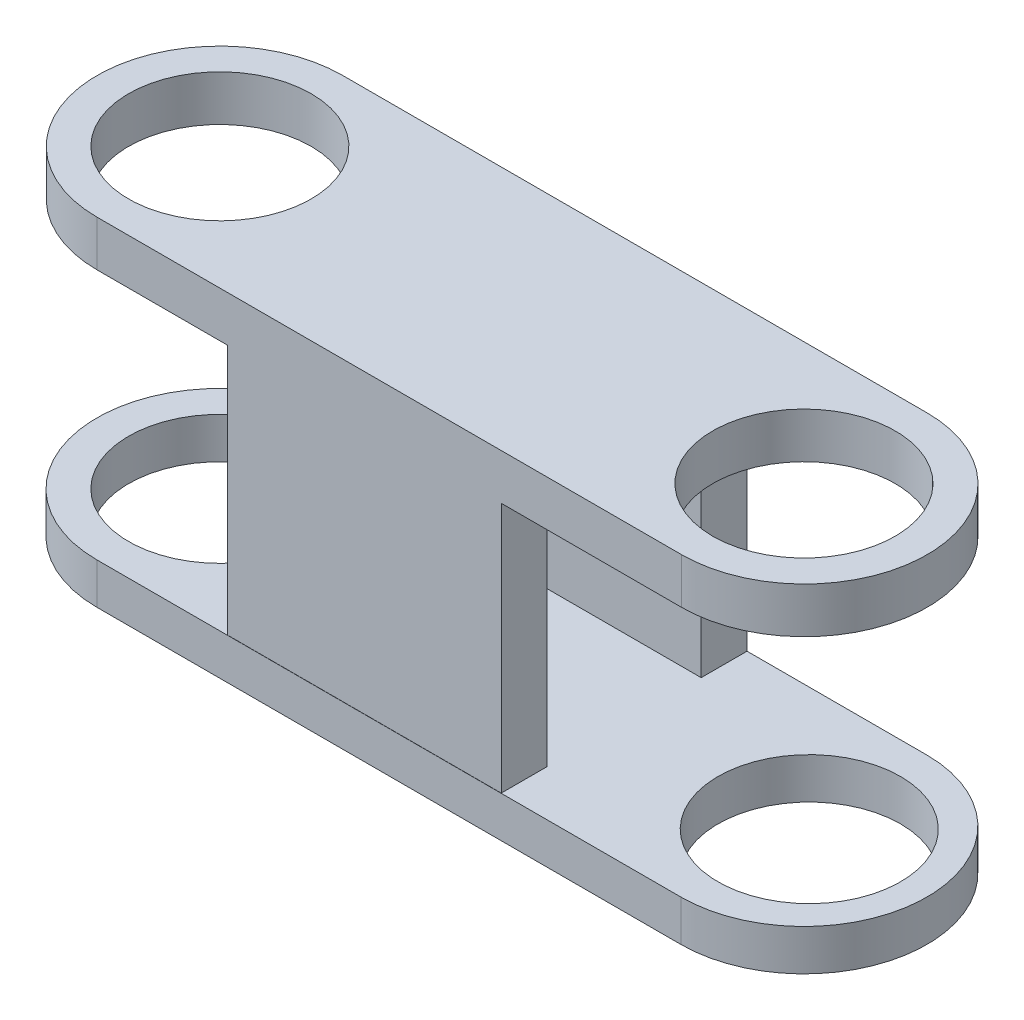
ISO-10303-21;
HEADER;
FILE_DESCRIPTION(('STEP AP214'),'2;1');
FILE_NAME('part.step','',(''),(''),'','','');
FILE_SCHEMA(('AUTOMOTIVE_DESIGN { 1 0 10303 214 1 1 1 1 }'));
ENDSEC;
DATA;
#1=APPLICATION_CONTEXT('core data for automotive mechanical design processes');
#2=APPLICATION_PROTOCOL_DEFINITION('international standard','automotive_design',2000,#1);
#3=PRODUCT_CONTEXT('',#1,'mechanical');
#4=PRODUCT('Part','Part','',(#3));
#5=PRODUCT_RELATED_PRODUCT_CATEGORY('part','',(#4));
#6=PRODUCT_DEFINITION_FORMATION('','',#4);
#7=PRODUCT_DEFINITION_CONTEXT('part definition',#1,'design');
#8=PRODUCT_DEFINITION('design','',#6,#7);
#9=PRODUCT_DEFINITION_SHAPE('','',#8);
#10=(LENGTH_UNIT() NAMED_UNIT(*) SI_UNIT(.MILLI.,.METRE.));
#11=(NAMED_UNIT(*) PLANE_ANGLE_UNIT() SI_UNIT($,.RADIAN.));
#12=(NAMED_UNIT(*) SI_UNIT($,.STERADIAN.) SOLID_ANGLE_UNIT());
#13=UNCERTAINTY_MEASURE_WITH_UNIT(LENGTH_MEASURE(1.E-05),#10,'distance_accuracy_value','');
#14=(GEOMETRIC_REPRESENTATION_CONTEXT(3) GLOBAL_UNCERTAINTY_ASSIGNED_CONTEXT((#13)) GLOBAL_UNIT_ASSIGNED_CONTEXT((#10,
#11,#12)) REPRESENTATION_CONTEXT('',''));
#15=CARTESIAN_POINT('',(0.,0.,0.));
#16=DIRECTION('',(0.,0.,1.));
#17=DIRECTION('',(1.,0.,0.));
#18=AXIS2_PLACEMENT_3D('',#15,#16,#17);
#19=CARTESIAN_POINT('',(0.,0.,0.));
#20=DIRECTION('',(0.,1.,0.));
#21=DIRECTION('',(0.,0.,1.));
#22=AXIS2_PLACEMENT_3D('',#19,#20,#21);
#23=PLANE('',#22);
#24=CARTESIAN_POINT('',(127.980340475688,0.,0.));
#25=DIRECTION('',(0.,1.,0.));
#26=DIRECTION('',(0.,0.,1.));
#27=AXIS2_PLACEMENT_3D('',#24,#25,#26);
#28=CIRCLE('',#27,20.);
#29=CARTESIAN_POINT('',(127.980340475688,0.,20.));
#30=VERTEX_POINT('',#29);
#31=EDGE_CURVE('E297',#30,#30,#28,.T.);
#32=ORIENTED_EDGE('',*,*,#31,.T.);
#33=EDGE_LOOP('',(#32));
#34=FACE_BOUND('',#33,.T.);
#35=CARTESIAN_POINT('',(0.,0.,0.));
#36=DIRECTION('',(0.,-1.,0.));
#37=DIRECTION('',(0.,0.,-1.));
#38=AXIS2_PLACEMENT_3D('',#35,#36,#37);
#39=CIRCLE('',#38,20.);
#40=CARTESIAN_POINT('',(0.,0.,-20.));
#41=VERTEX_POINT('',#40);
#42=EDGE_CURVE('E293',#41,#41,#39,.T.);
#43=ORIENTED_EDGE('',*,*,#42,.F.);
#44=EDGE_LOOP('',(#43));
#45=FACE_BOUND('',#44,.T.);
#46=DIRECTION('',(0.,0.,-1.));
#47=VECTOR('',#46,1.);
#48=CARTESIAN_POINT('',(28.558456052823,0.,-26.9042760508236));
#49=LINE('',#48,#47);
#50=CARTESIAN_POINT('',(28.558456052823,0.,-16.9042760508236));
#51=VERTEX_POINT('',#50);
#52=CARTESIAN_POINT('',(28.558456052823,0.,-26.9042760508236));
#53=VERTEX_POINT('',#52);
#54=EDGE_CURVE('E50',#51,#53,#49,.T.);
#55=ORIENTED_EDGE('',*,*,#54,.F.);
#56=DIRECTION('',(-1.,0.,0.));
#57=VECTOR('',#56,1.);
#58=CARTESIAN_POINT('',(28.558456052823,0.,-16.9042760508236));
#59=LINE('',#58,#57);
#60=CARTESIAN_POINT('',(88.558456052823,0.,-16.9042760508236));
#61=VERTEX_POINT('',#60);
#62=EDGE_CURVE('E186',#61,#51,#59,.T.);
#63=ORIENTED_EDGE('',*,*,#62,.F.);
#64=DIRECTION('',(0.,0.,1.));
#65=VECTOR('',#64,1.);
#66=CARTESIAN_POINT('',(88.558456052823,0.,-26.9042760508236));
#67=LINE('',#66,#65);
#68=CARTESIAN_POINT('',(88.558456052823,0.,-26.9042760508236));
#69=VERTEX_POINT('',#68);
#70=EDGE_CURVE('E176',#69,#61,#67,.T.);
#71=ORIENTED_EDGE('',*,*,#70,.F.);
#72=DIRECTION('',(-1.,0.,0.));
#73=VECTOR('',#72,1.);
#74=CARTESIAN_POINT('',(0.,0.,-26.9042760508236));
#75=LINE('',#74,#73);
#76=CARTESIAN_POINT('',(128.07951134054,0.,-26.9042760508236));
#77=VERTEX_POINT('',#76);
#78=EDGE_CURVE('E258',#77,#69,#75,.T.);
#79=ORIENTED_EDGE('',*,*,#78,.F.);
#80=CARTESIAN_POINT('',(128.07951134054,0.,0.));
#81=DIRECTION('',(0.,1.,0.));
#82=DIRECTION('',(0.,0.,1.));
#83=AXIS2_PLACEMENT_3D('',#80,#81,#82);
#84=CIRCLE('',#83,26.9042760508236);
#85=CARTESIAN_POINT('',(128.07951134054,0.,26.9042760508236));
#86=VERTEX_POINT('',#85);
#87=EDGE_CURVE('E254',#86,#77,#84,.T.);
#88=ORIENTED_EDGE('',*,*,#87,.F.);
#89=DIRECTION('',(1.,0.,0.));
#90=VECTOR('',#89,1.);
#91=CARTESIAN_POINT('',(0.,0.,26.9042760508236));
#92=LINE('',#91,#90);
#93=CARTESIAN_POINT('',(88.558456052823,0.,26.9042760508236));
#94=VERTEX_POINT('',#93);
#95=EDGE_CURVE('E245',#94,#86,#92,.T.);
#96=ORIENTED_EDGE('',*,*,#95,.F.);
#97=DIRECTION('',(0.,0.,1.));
#98=VECTOR('',#97,1.);
#99=CARTESIAN_POINT('',(88.558456052823,0.,26.9042760508236));
#100=LINE('',#99,#98);
#101=CARTESIAN_POINT('',(88.558456052823,0.,16.9042760508236));
#102=VERTEX_POINT('',#101);
#103=EDGE_CURVE('E211',#102,#94,#100,.T.);
#104=ORIENTED_EDGE('',*,*,#103,.F.);
#105=DIRECTION('',(1.,0.,0.));
#106=VECTOR('',#105,1.);
#107=CARTESIAN_POINT('',(28.558456052823,0.,16.9042760508236));
#108=LINE('',#107,#106);
#109=CARTESIAN_POINT('',(28.558456052823,0.,16.9042760508236));
#110=VERTEX_POINT('',#109);
#111=EDGE_CURVE('E58',#110,#102,#108,.T.);
#112=ORIENTED_EDGE('',*,*,#111,.F.);
#113=DIRECTION('',(0.,0.,-1.));
#114=VECTOR('',#113,1.);
#115=CARTESIAN_POINT('',(28.558456052823,0.,26.9042760508236));
#116=LINE('',#115,#114);
#117=CARTESIAN_POINT('',(28.558456052823,0.,26.9042760508236));
#118=VERTEX_POINT('',#117);
#119=EDGE_CURVE('E206',#118,#110,#116,.T.);
#120=ORIENTED_EDGE('',*,*,#119,.F.);
#121=CARTESIAN_POINT('',(0.,0.,26.9042760508236));
#122=VERTEX_POINT('',#121);
#123=EDGE_CURVE('E248',#122,#118,#92,.T.);
#124=ORIENTED_EDGE('',*,*,#123,.F.);
#125=CARTESIAN_POINT('',(0.,0.,0.));
#126=DIRECTION('',(0.,1.,0.));
#127=DIRECTION('',(0.,0.,1.));
#128=AXIS2_PLACEMENT_3D('',#125,#126,#127);
#129=CIRCLE('',#128,26.9042760508236);
#130=CARTESIAN_POINT('',(0.,0.,-26.9042760508236));
#131=VERTEX_POINT('',#130);
#132=EDGE_CURVE('E249',#131,#122,#129,.T.);
#133=ORIENTED_EDGE('',*,*,#132,.F.);
#134=EDGE_CURVE('E257',#53,#131,#75,.T.);
#135=ORIENTED_EDGE('',*,*,#134,.F.);
#136=EDGE_LOOP('',(#55,#63,#71,#79,#88,#96,#104,#112,#120,#124,#133,#135));
#137=FACE_BOUND('',#136,.T.);
#138=ADVANCED_FACE('F33',(#34,#45,#137),#23,.F.);
#139=CARTESIAN_POINT('',(0.,10.,0.));
#140=DIRECTION('',(0.,-1.,0.));
#141=DIRECTION('',(0.,0.,-1.));
#142=AXIS2_PLACEMENT_3D('',#139,#140,#141);
#143=CYLINDRICAL_SURFACE('',#142,26.9042760508236);
#144=ORIENTED_EDGE('',*,*,#132,.T.);
#145=DIRECTION('',(0.,-1.,0.));
#146=VECTOR('',#145,1.);
#147=CARTESIAN_POINT('',(0.,10.,26.9042760508236));
#148=LINE('',#147,#146);
#149=CARTESIAN_POINT('',(0.,10.,26.9042760508236));
#150=VERTEX_POINT('',#149);
#151=EDGE_CURVE('E11',#150,#122,#148,.T.);
#152=ORIENTED_EDGE('',*,*,#151,.F.);
#153=CARTESIAN_POINT('',(0.,10.,0.));
#154=DIRECTION('',(0.,1.,0.));
#155=DIRECTION('',(0.,0.,1.));
#156=AXIS2_PLACEMENT_3D('',#153,#154,#155);
#157=CIRCLE('',#156,26.9042760508236);
#158=CARTESIAN_POINT('',(0.,10.,-26.9042760508236));
#159=VERTEX_POINT('',#158);
#160=EDGE_CURVE('E261',#159,#150,#157,.T.);
#161=ORIENTED_EDGE('',*,*,#160,.F.);
#162=DIRECTION('',(0.,-1.,0.));
#163=VECTOR('',#162,1.);
#164=CARTESIAN_POINT('',(0.,10.,-26.9042760508236));
#165=LINE('',#164,#163);
#166=EDGE_CURVE('E262',#159,#131,#165,.T.);
#167=ORIENTED_EDGE('',*,*,#166,.T.);
#168=EDGE_LOOP('',(#144,#152,#161,#167));
#169=FACE_BOUND('',#168,.T.);
#170=ADVANCED_FACE('F35',(#169),#143,.T.);
#171=CARTESIAN_POINT('',(0.,10.,26.9042760508236));
#172=DIRECTION('',(0.,0.,-1.));
#173=DIRECTION('',(-1.,0.,0.));
#174=AXIS2_PLACEMENT_3D('',#171,#172,#173);
#175=PLANE('',#174);
#176=ORIENTED_EDGE('',*,*,#123,.T.);
#177=DIRECTION('',(0.,1.,0.));
#178=VECTOR('',#177,1.);
#179=CARTESIAN_POINT('',(28.558456052823,-55.,26.9042760508236));
#180=LINE('',#179,#178);
#181=CARTESIAN_POINT('',(28.558456052823,-55.,26.9042760508236));
#182=VERTEX_POINT('',#181);
#183=EDGE_CURVE('E220',#182,#118,#180,.T.);
#184=ORIENTED_EDGE('',*,*,#183,.F.);
#185=DIRECTION('',(-1.,0.,0.));
#186=VECTOR('',#185,1.);
#187=CARTESIAN_POINT('',(28.558456052823,-55.,26.9042760508236));
#188=LINE('',#187,#186);
#189=CARTESIAN_POINT('',(88.558456052823,-55.,26.9042760508236));
#190=VERTEX_POINT('',#189);
#191=EDGE_CURVE('E217',#190,#182,#188,.T.);
#192=ORIENTED_EDGE('',*,*,#191,.F.);
#193=DIRECTION('',(0.,1.,0.));
#194=VECTOR('',#193,1.);
#195=CARTESIAN_POINT('',(88.558456052823,-55.,26.9042760508236));
#196=LINE('',#195,#194);
#197=EDGE_CURVE('E231',#190,#94,#196,.T.);
#198=ORIENTED_EDGE('',*,*,#197,.T.);
#199=ORIENTED_EDGE('',*,*,#95,.T.);
#200=DIRECTION('',(0.,-1.,0.));
#201=VECTOR('',#200,1.);
#202=CARTESIAN_POINT('',(128.07951134054,10.,26.9042760508236));
#203=LINE('',#202,#201);
#204=CARTESIAN_POINT('',(128.07951134054,10.,26.9042760508236));
#205=VERTEX_POINT('',#204);
#206=EDGE_CURVE('E42',#205,#86,#203,.T.);
#207=ORIENTED_EDGE('',*,*,#206,.F.);
#208=DIRECTION('',(1.,0.,0.));
#209=VECTOR('',#208,1.);
#210=CARTESIAN_POINT('',(0.,10.,26.9042760508236));
#211=LINE('',#210,#209);
#212=EDGE_CURVE('E288',#150,#205,#211,.T.);
#213=ORIENTED_EDGE('',*,*,#212,.F.);
#214=ORIENTED_EDGE('',*,*,#151,.T.);
#215=EDGE_LOOP('',(#176,#184,#192,#198,#199,#207,#213,#214));
#216=FACE_BOUND('',#215,.T.);
#217=ADVANCED_FACE('F310',(#216),#175,.F.);
#218=CARTESIAN_POINT('',(128.07951134054,10.,0.));
#219=DIRECTION('',(0.,-1.,0.));
#220=DIRECTION('',(0.,0.,-1.));
#221=AXIS2_PLACEMENT_3D('',#218,#219,#220);
#222=CYLINDRICAL_SURFACE('',#221,26.9042760508236);
#223=ORIENTED_EDGE('',*,*,#87,.T.);
#224=DIRECTION('',(0.,-1.,0.));
#225=VECTOR('',#224,1.);
#226=CARTESIAN_POINT('',(128.07951134054,10.,-26.9042760508236));
#227=LINE('',#226,#225);
#228=CARTESIAN_POINT('',(128.07951134054,10.,-26.9042760508236));
#229=VERTEX_POINT('',#228);
#230=EDGE_CURVE('E265',#229,#77,#227,.T.);
#231=ORIENTED_EDGE('',*,*,#230,.F.);
#232=CARTESIAN_POINT('',(128.07951134054,10.,0.));
#233=DIRECTION('',(0.,1.,0.));
#234=DIRECTION('',(0.,0.,1.));
#235=AXIS2_PLACEMENT_3D('',#232,#233,#234);
#236=CIRCLE('',#235,26.9042760508236);
#237=EDGE_CURVE('E276',#205,#229,#236,.T.);
#238=ORIENTED_EDGE('',*,*,#237,.F.);
#239=ORIENTED_EDGE('',*,*,#206,.T.);
#240=EDGE_LOOP('',(#223,#231,#238,#239));
#241=FACE_BOUND('',#240,.T.);
#242=ADVANCED_FACE('F274',(#241),#222,.T.);
#243=CARTESIAN_POINT('',(0.,10.,-26.9042760508236));
#244=DIRECTION('',(0.,0.,1.));
#245=DIRECTION('',(1.,0.,0.));
#246=AXIS2_PLACEMENT_3D('',#243,#244,#245);
#247=PLANE('',#246);
#248=ORIENTED_EDGE('',*,*,#78,.T.);
#249=DIRECTION('',(0.,1.,0.));
#250=VECTOR('',#249,1.);
#251=CARTESIAN_POINT('',(88.558456052823,-55.,-26.9042760508236));
#252=LINE('',#251,#250);
#253=CARTESIAN_POINT('',(88.558456052823,-55.,-26.9042760508236));
#254=VERTEX_POINT('',#253);
#255=EDGE_CURVE('E202',#254,#69,#252,.T.);
#256=ORIENTED_EDGE('',*,*,#255,.F.);
#257=DIRECTION('',(1.,0.,0.));
#258=VECTOR('',#257,1.);
#259=CARTESIAN_POINT('',(28.558456052823,-55.,-26.9042760508236));
#260=LINE('',#259,#258);
#261=CARTESIAN_POINT('',(28.558456052823,-55.,-26.9042760508236));
#262=VERTEX_POINT('',#261);
#263=EDGE_CURVE('E185',#262,#254,#260,.T.);
#264=ORIENTED_EDGE('',*,*,#263,.F.);
#265=DIRECTION('',(0.,1.,0.));
#266=VECTOR('',#265,1.);
#267=CARTESIAN_POINT('',(28.558456052823,-55.,-26.9042760508236));
#268=LINE('',#267,#266);
#269=EDGE_CURVE('E204',#262,#53,#268,.T.);
#270=ORIENTED_EDGE('',*,*,#269,.T.);
#271=ORIENTED_EDGE('',*,*,#134,.T.);
#272=ORIENTED_EDGE('',*,*,#166,.F.);
#273=DIRECTION('',(-1.,0.,0.));
#274=VECTOR('',#273,1.);
#275=CARTESIAN_POINT('',(0.,10.,-26.9042760508236));
#276=LINE('',#275,#274);
#277=EDGE_CURVE('E266',#229,#159,#276,.T.);
#278=ORIENTED_EDGE('',*,*,#277,.F.);
#279=ORIENTED_EDGE('',*,*,#230,.T.);
#280=EDGE_LOOP('',(#248,#256,#264,#270,#271,#272,#278,#279));
#281=FACE_BOUND('',#280,.T.);
#282=ADVANCED_FACE('F281',(#281),#247,.F.);
#283=CARTESIAN_POINT('',(0.,10.,0.));
#284=DIRECTION('',(0.,1.,0.));
#285=DIRECTION('',(0.,0.,1.));
#286=AXIS2_PLACEMENT_3D('',#283,#284,#285);
#287=PLANE('',#286);
#288=CARTESIAN_POINT('',(127.980340475688,10.,0.));
#289=DIRECTION('',(0.,1.,0.));
#290=DIRECTION('',(0.,0.,1.));
#291=AXIS2_PLACEMENT_3D('',#288,#289,#290);
#292=CIRCLE('',#291,20.);
#293=CARTESIAN_POINT('',(127.980340475688,10.,20.));
#294=VERTEX_POINT('',#293);
#295=EDGE_CURVE('E300',#294,#294,#292,.T.);
#296=ORIENTED_EDGE('',*,*,#295,.F.);
#297=EDGE_LOOP('',(#296));
#298=FACE_BOUND('',#297,.T.);
#299=CARTESIAN_POINT('',(0.,9.99999999999999,0.));
#300=DIRECTION('',(0.,-1.,0.));
#301=DIRECTION('',(0.,0.,-1.));
#302=AXIS2_PLACEMENT_3D('',#299,#300,#301);
#303=CIRCLE('',#302,20.);
#304=CARTESIAN_POINT('',(0.,9.99999999999999,-20.));
#305=VERTEX_POINT('',#304);
#306=EDGE_CURVE('E296',#305,#305,#303,.T.);
#307=ORIENTED_EDGE('',*,*,#306,.T.);
#308=EDGE_LOOP('',(#307));
#309=FACE_BOUND('',#308,.T.);
#310=ORIENTED_EDGE('',*,*,#160,.T.);
#311=ORIENTED_EDGE('',*,*,#212,.T.);
#312=ORIENTED_EDGE('',*,*,#237,.T.);
#313=ORIENTED_EDGE('',*,*,#277,.T.);
#314=EDGE_LOOP('',(#310,#311,#312,#313));
#315=FACE_BOUND('',#314,.T.);
#316=ADVANCED_FACE('F343',(#298,#309,#315),#287,.T.);
#317=CARTESIAN_POINT('',(0.,9.99999999999999,0.));
#318=DIRECTION('',(0.,-1.,0.));
#319=DIRECTION('',(0.,0.,-1.));
#320=AXIS2_PLACEMENT_3D('',#317,#318,#319);
#321=CYLINDRICAL_SURFACE('',#320,20.);
#322=ORIENTED_EDGE('',*,*,#306,.F.);
#323=EDGE_LOOP('',(#322));
#324=FACE_BOUND('',#323,.T.);
#325=ORIENTED_EDGE('',*,*,#42,.T.);
#326=EDGE_LOOP('',(#325));
#327=FACE_BOUND('',#326,.T.);
#328=ADVANCED_FACE('F369',(#324,#327),#321,.F.);
#329=CARTESIAN_POINT('',(127.980340475688,0.,0.));
#330=DIRECTION('',(0.,1.,0.));
#331=DIRECTION('',(0.,0.,1.));
#332=AXIS2_PLACEMENT_3D('',#329,#330,#331);
#333=CYLINDRICAL_SURFACE('',#332,20.);
#334=ORIENTED_EDGE('',*,*,#31,.F.);
#335=EDGE_LOOP('',(#334));
#336=FACE_BOUND('',#335,.T.);
#337=ORIENTED_EDGE('',*,*,#295,.T.);
#338=EDGE_LOOP('',(#337));
#339=FACE_BOUND('',#338,.T.);
#340=ADVANCED_FACE('F376',(#336,#339),#333,.F.);
#341=CARTESIAN_POINT('',(28.558456052823,-55.,26.9042760508236));
#342=DIRECTION('',(1.,0.,0.));
#343=DIRECTION('',(0.,0.,-1.));
#344=AXIS2_PLACEMENT_3D('',#341,#342,#343);
#345=PLANE('',#344);
#346=ORIENTED_EDGE('',*,*,#119,.T.);
#347=DIRECTION('',(0.,1.,0.));
#348=VECTOR('',#347,1.);
#349=CARTESIAN_POINT('',(28.558456052823,-55.,16.9042760508236));
#350=LINE('',#349,#348);
#351=CARTESIAN_POINT('',(28.558456052823,-55.,16.9042760508236));
#352=VERTEX_POINT('',#351);
#353=EDGE_CURVE('E236',#352,#110,#350,.T.);
#354=ORIENTED_EDGE('',*,*,#353,.F.);
#355=DIRECTION('',(0.,0.,-1.));
#356=VECTOR('',#355,1.);
#357=CARTESIAN_POINT('',(28.558456052823,-55.,26.9042760508236));
#358=LINE('',#357,#356);
#359=EDGE_CURVE('E207',#182,#352,#358,.T.);
#360=ORIENTED_EDGE('',*,*,#359,.F.);
#361=ORIENTED_EDGE('',*,*,#183,.T.);
#362=EDGE_LOOP('',(#346,#354,#360,#361));
#363=FACE_BOUND('',#362,.T.);
#364=ADVANCED_FACE('F307',(#363),#345,.F.);
#365=CARTESIAN_POINT('',(28.558456052823,-55.,16.9042760508236));
#366=DIRECTION('',(0.,0.,1.));
#367=DIRECTION('',(1.,0.,0.));
#368=AXIS2_PLACEMENT_3D('',#365,#366,#367);
#369=PLANE('',#368);
#370=ORIENTED_EDGE('',*,*,#111,.T.);
#371=DIRECTION('',(0.,1.,0.));
#372=VECTOR('',#371,1.);
#373=CARTESIAN_POINT('',(88.558456052823,-55.,16.9042760508236));
#374=LINE('',#373,#372);
#375=CARTESIAN_POINT('',(88.558456052823,-55.,16.9042760508236));
#376=VERTEX_POINT('',#375);
#377=EDGE_CURVE('E224',#376,#102,#374,.T.);
#378=ORIENTED_EDGE('',*,*,#377,.F.);
#379=DIRECTION('',(1.,0.,0.));
#380=VECTOR('',#379,1.);
#381=CARTESIAN_POINT('',(28.558456052823,-55.,16.9042760508236));
#382=LINE('',#381,#380);
#383=EDGE_CURVE('E210',#352,#376,#382,.T.);
#384=ORIENTED_EDGE('',*,*,#383,.F.);
#385=ORIENTED_EDGE('',*,*,#353,.T.);
#386=EDGE_LOOP('',(#370,#378,#384,#385));
#387=FACE_BOUND('',#386,.T.);
#388=ADVANCED_FACE('F306',(#387),#369,.F.);
#389=CARTESIAN_POINT('',(88.558456052823,-55.,26.9042760508236));
#390=DIRECTION('',(-1.,0.,0.));
#391=DIRECTION('',(0.,0.,1.));
#392=AXIS2_PLACEMENT_3D('',#389,#390,#391);
#393=PLANE('',#392);
#394=ORIENTED_EDGE('',*,*,#103,.T.);
#395=ORIENTED_EDGE('',*,*,#197,.F.);
#396=DIRECTION('',(0.,0.,1.));
#397=VECTOR('',#396,1.);
#398=CARTESIAN_POINT('',(88.558456052823,-55.,26.9042760508236));
#399=LINE('',#398,#397);
#400=EDGE_CURVE('E214',#376,#190,#399,.T.);
#401=ORIENTED_EDGE('',*,*,#400,.F.);
#402=ORIENTED_EDGE('',*,*,#377,.T.);
#403=EDGE_LOOP('',(#394,#395,#401,#402));
#404=FACE_BOUND('',#403,.T.);
#405=ADVANCED_FACE('F332',(#404),#393,.F.);
#406=CARTESIAN_POINT('',(28.558456052823,-55.,-26.9042760508236));
#407=DIRECTION('',(1.,0.,0.));
#408=DIRECTION('',(0.,0.,-1.));
#409=AXIS2_PLACEMENT_3D('',#406,#407,#408);
#410=PLANE('',#409);
#411=ORIENTED_EDGE('',*,*,#54,.T.);
#412=ORIENTED_EDGE('',*,*,#269,.F.);
#413=DIRECTION('',(0.,0.,-1.));
#414=VECTOR('',#413,1.);
#415=CARTESIAN_POINT('',(28.558456052823,-55.,-26.9042760508236));
#416=LINE('',#415,#414);
#417=CARTESIAN_POINT('',(28.558456052823,-55.,-16.9042760508236));
#418=VERTEX_POINT('',#417);
#419=EDGE_CURVE('E182',#418,#262,#416,.T.);
#420=ORIENTED_EDGE('',*,*,#419,.F.);
#421=DIRECTION('',(0.,1.,0.));
#422=VECTOR('',#421,1.);
#423=CARTESIAN_POINT('',(28.558456052823,-55.,-16.9042760508236));
#424=LINE('',#423,#422);
#425=EDGE_CURVE('E194',#418,#51,#424,.T.);
#426=ORIENTED_EDGE('',*,*,#425,.T.);
#427=EDGE_LOOP('',(#411,#412,#420,#426));
#428=FACE_BOUND('',#427,.T.);
#429=ADVANCED_FACE('F315',(#428),#410,.F.);
#430=CARTESIAN_POINT('',(88.558456052823,-55.,-26.9042760508236));
#431=DIRECTION('',(-1.,0.,0.));
#432=DIRECTION('',(0.,0.,1.));
#433=AXIS2_PLACEMENT_3D('',#430,#431,#432);
#434=PLANE('',#433);
#435=ORIENTED_EDGE('',*,*,#70,.T.);
#436=DIRECTION('',(0.,1.,0.));
#437=VECTOR('',#436,1.);
#438=CARTESIAN_POINT('',(88.558456052823,-55.,-16.9042760508236));
#439=LINE('',#438,#437);
#440=CARTESIAN_POINT('',(88.558456052823,-55.,-16.9042760508236));
#441=VERTEX_POINT('',#440);
#442=EDGE_CURVE('E199',#441,#61,#439,.T.);
#443=ORIENTED_EDGE('',*,*,#442,.F.);
#444=DIRECTION('',(0.,0.,1.));
#445=VECTOR('',#444,1.);
#446=CARTESIAN_POINT('',(88.558456052823,-55.,-26.9042760508236));
#447=LINE('',#446,#445);
#448=EDGE_CURVE('E189',#254,#441,#447,.T.);
#449=ORIENTED_EDGE('',*,*,#448,.F.);
#450=ORIENTED_EDGE('',*,*,#255,.T.);
#451=EDGE_LOOP('',(#435,#443,#449,#450));
#452=FACE_BOUND('',#451,.T.);
#453=ADVANCED_FACE('F324',(#452),#434,.F.);
#454=CARTESIAN_POINT('',(28.558456052823,-55.,-16.9042760508236));
#455=DIRECTION('',(0.,0.,-1.));
#456=DIRECTION('',(-1.,0.,0.));
#457=AXIS2_PLACEMENT_3D('',#454,#455,#456);
#458=PLANE('',#457);
#459=ORIENTED_EDGE('',*,*,#62,.T.);
#460=ORIENTED_EDGE('',*,*,#425,.F.);
#461=DIRECTION('',(-1.,0.,0.));
#462=VECTOR('',#461,1.);
#463=CARTESIAN_POINT('',(28.558456052823,-55.,-16.9042760508236));
#464=LINE('',#463,#462);
#465=EDGE_CURVE('E192',#441,#418,#464,.T.);
#466=ORIENTED_EDGE('',*,*,#465,.F.);
#467=ORIENTED_EDGE('',*,*,#442,.T.);
#468=EDGE_LOOP('',(#459,#460,#466,#467));
#469=FACE_BOUND('',#468,.T.);
#470=ADVANCED_FACE('F322',(#469),#458,.F.);
#471=CARTESIAN_POINT('',(0.,-55.,0.));
#472=DIRECTION('',(0.,-1.,0.));
#473=DIRECTION('',(0.,0.,-1.));
#474=AXIS2_PLACEMENT_3D('',#471,#472,#473);
#475=PLANE('',#474);
#476=CARTESIAN_POINT('',(0.,-55.,0.));
#477=DIRECTION('',(0.,-1.,0.));
#478=DIRECTION('',(0.,0.,-1.));
#479=AXIS2_PLACEMENT_3D('',#476,#477,#478);
#480=CIRCLE('',#479,20.);
#481=CARTESIAN_POINT('',(0.,-55.,-20.));
#482=VERTEX_POINT('',#481);
#483=EDGE_CURVE('E499',#482,#482,#480,.T.);
#484=ORIENTED_EDGE('',*,*,#483,.T.);
#485=EDGE_LOOP('',(#484));
#486=FACE_BOUND('',#485,.T.);
#487=CARTESIAN_POINT('',(129.13998933297,-55.,0.));
#488=DIRECTION('',(0.,-1.,0.));
#489=DIRECTION('',(0.,0.,-1.));
#490=AXIS2_PLACEMENT_3D('',#487,#488,#489);
#491=CIRCLE('',#490,20.);
#492=CARTESIAN_POINT('',(129.13998933297,-55.,-20.));
#493=VERTEX_POINT('',#492);
#494=EDGE_CURVE('E503',#493,#493,#491,.T.);
#495=ORIENTED_EDGE('',*,*,#494,.T.);
#496=EDGE_LOOP('',(#495));
#497=FACE_BOUND('',#496,.T.);
#498=ORIENTED_EDGE('',*,*,#419,.T.);
#499=ORIENTED_EDGE('',*,*,#263,.T.);
#500=ORIENTED_EDGE('',*,*,#448,.T.);
#501=ORIENTED_EDGE('',*,*,#465,.T.);
#502=EDGE_LOOP('',(#498,#499,#500,#501));
#503=FACE_BOUND('',#502,.T.);
#504=CARTESIAN_POINT('',(0.,-55.,0.));
#505=DIRECTION('',(0.,-1.,0.));
#506=DIRECTION('',(0.,0.,-1.));
#507=AXIS2_PLACEMENT_3D('',#504,#505,#506);
#508=CIRCLE('',#507,26.9506673073216);
#509=CARTESIAN_POINT('',(0.,-55.,26.9506673073216));
#510=VERTEX_POINT('',#509);
#511=CARTESIAN_POINT('',(0.,-55.,-26.9506673073216));
#512=VERTEX_POINT('',#511);
#513=EDGE_CURVE('E174',#510,#512,#508,.T.);
#514=ORIENTED_EDGE('',*,*,#513,.F.);
#515=DIRECTION('',(-1.,0.,0.));
#516=VECTOR('',#515,1.);
#517=CARTESIAN_POINT('',(0.,-55.,26.9506673073216));
#518=LINE('',#517,#516);
#519=CARTESIAN_POINT('',(127.980340475688,-55.,26.9506673073216));
#520=VERTEX_POINT('',#519);
#521=EDGE_CURVE('E170',#520,#510,#518,.T.);
#522=ORIENTED_EDGE('',*,*,#521,.F.);
#523=CARTESIAN_POINT('',(127.980340475688,-55.,0.));
#524=DIRECTION('',(0.,-1.,0.));
#525=DIRECTION('',(0.,0.,-1.));
#526=AXIS2_PLACEMENT_3D('',#523,#524,#525);
#527=CIRCLE('',#526,26.9506673073216);
#528=CARTESIAN_POINT('',(127.980340475688,-55.,-26.9506673073216));
#529=VERTEX_POINT('',#528);
#530=EDGE_CURVE('E515',#529,#520,#527,.T.);
#531=ORIENTED_EDGE('',*,*,#530,.F.);
#532=DIRECTION('',(1.,0.,0.));
#533=VECTOR('',#532,1.);
#534=CARTESIAN_POINT('',(0.,-55.,-26.9506673073216));
#535=LINE('',#534,#533);
#536=EDGE_CURVE('E513',#512,#529,#535,.T.);
#537=ORIENTED_EDGE('',*,*,#536,.F.);
#538=EDGE_LOOP('',(#514,#522,#531,#537));
#539=FACE_BOUND('',#538,.T.);
#540=ORIENTED_EDGE('',*,*,#400,.T.);
#541=ORIENTED_EDGE('',*,*,#191,.T.);
#542=ORIENTED_EDGE('',*,*,#359,.T.);
#543=ORIENTED_EDGE('',*,*,#383,.T.);
#544=EDGE_LOOP('',(#540,#541,#542,#543));
#545=FACE_BOUND('',#544,.T.);
#546=ADVANCED_FACE('F318',(#486,#497,#503,#539,#545),#475,.F.);
#547=CARTESIAN_POINT('',(0.,-64.,0.));
#548=DIRECTION('',(0.,1.,0.));
#549=DIRECTION('',(0.,0.,1.));
#550=AXIS2_PLACEMENT_3D('',#547,#548,#549);
#551=CYLINDRICAL_SURFACE('',#550,26.9506673073216);
#552=ORIENTED_EDGE('',*,*,#513,.T.);
#553=DIRECTION('',(0.,1.,0.));
#554=VECTOR('',#553,1.);
#555=CARTESIAN_POINT('',(0.,-64.,-26.9506673073216));
#556=LINE('',#555,#554);
#557=CARTESIAN_POINT('',(0.,-64.,-26.9506673073216));
#558=VERTEX_POINT('',#557);
#559=EDGE_CURVE('E154',#558,#512,#556,.T.);
#560=ORIENTED_EDGE('',*,*,#559,.F.);
#561=CARTESIAN_POINT('',(0.,-64.,0.));
#562=DIRECTION('',(0.,-1.,0.));
#563=DIRECTION('',(0.,0.,-1.));
#564=AXIS2_PLACEMENT_3D('',#561,#562,#563);
#565=CIRCLE('',#564,26.9506673073216);
#566=CARTESIAN_POINT('',(0.,-64.,26.9506673073216));
#567=VERTEX_POINT('',#566);
#568=EDGE_CURVE('E161',#567,#558,#565,.T.);
#569=ORIENTED_EDGE('',*,*,#568,.F.);
#570=DIRECTION('',(0.,1.,0.));
#571=VECTOR('',#570,1.);
#572=CARTESIAN_POINT('',(0.,-64.,26.9506673073216));
#573=LINE('',#572,#571);
#574=EDGE_CURVE('E511',#567,#510,#573,.T.);
#575=ORIENTED_EDGE('',*,*,#574,.T.);
#576=EDGE_LOOP('',(#552,#560,#569,#575));
#577=FACE_BOUND('',#576,.T.);
#578=ADVANCED_FACE('F172',(#577),#551,.T.);
#579=CARTESIAN_POINT('',(0.,-64.,-26.9506673073216));
#580=DIRECTION('',(0.,0.,1.));
#581=DIRECTION('',(1.,0.,0.));
#582=AXIS2_PLACEMENT_3D('',#579,#580,#581);
#583=PLANE('',#582);
#584=ORIENTED_EDGE('',*,*,#536,.T.);
#585=DIRECTION('',(0.,1.,0.));
#586=VECTOR('',#585,1.);
#587=CARTESIAN_POINT('',(127.980340475688,-64.,-26.9506673073216));
#588=LINE('',#587,#586);
#589=CARTESIAN_POINT('',(127.980340475688,-64.,-26.9506673073216));
#590=VERTEX_POINT('',#589);
#591=EDGE_CURVE('E157',#590,#529,#588,.T.);
#592=ORIENTED_EDGE('',*,*,#591,.F.);
#593=DIRECTION('',(1.,0.,0.));
#594=VECTOR('',#593,1.);
#595=CARTESIAN_POINT('',(0.,-64.,-26.9506673073216));
#596=LINE('',#595,#594);
#597=EDGE_CURVE('E150',#558,#590,#596,.T.);
#598=ORIENTED_EDGE('',*,*,#597,.F.);
#599=ORIENTED_EDGE('',*,*,#559,.T.);
#600=EDGE_LOOP('',(#584,#592,#598,#599));
#601=FACE_BOUND('',#600,.T.);
#602=ADVANCED_FACE('F152',(#601),#583,.F.);
#603=CARTESIAN_POINT('',(127.980340475688,-64.,0.));
#604=DIRECTION('',(0.,1.,0.));
#605=DIRECTION('',(0.,0.,1.));
#606=AXIS2_PLACEMENT_3D('',#603,#604,#605);
#607=CYLINDRICAL_SURFACE('',#606,26.9506673073216);
#608=ORIENTED_EDGE('',*,*,#530,.T.);
#609=DIRECTION('',(0.,1.,0.));
#610=VECTOR('',#609,1.);
#611=CARTESIAN_POINT('',(127.980340475688,-64.,26.9506673073216));
#612=LINE('',#611,#610);
#613=CARTESIAN_POINT('',(127.980340475688,-64.,26.9506673073216));
#614=VERTEX_POINT('',#613);
#615=EDGE_CURVE('E178',#614,#520,#612,.T.);
#616=ORIENTED_EDGE('',*,*,#615,.F.);
#617=CARTESIAN_POINT('',(127.980340475688,-64.,0.));
#618=DIRECTION('',(0.,-1.,0.));
#619=DIRECTION('',(0.,0.,-1.));
#620=AXIS2_PLACEMENT_3D('',#617,#618,#619);
#621=CIRCLE('',#620,26.9506673073216);
#622=EDGE_CURVE('E160',#590,#614,#621,.T.);
#623=ORIENTED_EDGE('',*,*,#622,.F.);
#624=ORIENTED_EDGE('',*,*,#591,.T.);
#625=EDGE_LOOP('',(#608,#616,#623,#624));
#626=FACE_BOUND('',#625,.T.);
#627=ADVANCED_FACE('F434',(#626),#607,.T.);
#628=CARTESIAN_POINT('',(0.,-64.,26.9506673073216));
#629=DIRECTION('',(0.,0.,-1.));
#630=DIRECTION('',(-1.,0.,0.));
#631=AXIS2_PLACEMENT_3D('',#628,#629,#630);
#632=PLANE('',#631);
#633=ORIENTED_EDGE('',*,*,#521,.T.);
#634=ORIENTED_EDGE('',*,*,#574,.F.);
#635=DIRECTION('',(-1.,0.,0.));
#636=VECTOR('',#635,1.);
#637=CARTESIAN_POINT('',(0.,-64.,26.9506673073216));
#638=LINE('',#637,#636);
#639=EDGE_CURVE('E166',#614,#567,#638,.T.);
#640=ORIENTED_EDGE('',*,*,#639,.F.);
#641=ORIENTED_EDGE('',*,*,#615,.T.);
#642=EDGE_LOOP('',(#633,#634,#640,#641));
#643=FACE_BOUND('',#642,.T.);
#644=ADVANCED_FACE('F443',(#643),#632,.F.);
#645=CARTESIAN_POINT('',(0.,-64.,0.));
#646=DIRECTION('',(0.,-1.,0.));
#647=DIRECTION('',(0.,0.,-1.));
#648=AXIS2_PLACEMENT_3D('',#645,#646,#647);
#649=PLANE('',#648);
#650=CARTESIAN_POINT('',(0.,-64.,0.));
#651=DIRECTION('',(0.,-1.,0.));
#652=DIRECTION('',(0.,0.,-1.));
#653=AXIS2_PLACEMENT_3D('',#650,#651,#652);
#654=CIRCLE('',#653,20.);
#655=CARTESIAN_POINT('',(0.,-64.,-20.));
#656=VERTEX_POINT('',#655);
#657=EDGE_CURVE('E496',#656,#656,#654,.T.);
#658=ORIENTED_EDGE('',*,*,#657,.F.);
#659=EDGE_LOOP('',(#658));
#660=FACE_BOUND('',#659,.T.);
#661=CARTESIAN_POINT('',(129.13998933297,-64.,0.));
#662=DIRECTION('',(0.,-1.,0.));
#663=DIRECTION('',(0.,0.,-1.));
#664=AXIS2_PLACEMENT_3D('',#661,#662,#663);
#665=CIRCLE('',#664,20.);
#666=CARTESIAN_POINT('',(129.13998933297,-64.,-20.));
#667=VERTEX_POINT('',#666);
#668=EDGE_CURVE('E500',#667,#667,#665,.T.);
#669=ORIENTED_EDGE('',*,*,#668,.F.);
#670=EDGE_LOOP('',(#669));
#671=FACE_BOUND('',#670,.T.);
#672=ORIENTED_EDGE('',*,*,#568,.T.);
#673=ORIENTED_EDGE('',*,*,#597,.T.);
#674=ORIENTED_EDGE('',*,*,#622,.T.);
#675=ORIENTED_EDGE('',*,*,#639,.T.);
#676=EDGE_LOOP('',(#672,#673,#674,#675));
#677=FACE_BOUND('',#676,.T.);
#678=ADVANCED_FACE('F164',(#660,#671,#677),#649,.T.);
#679=CARTESIAN_POINT('',(129.13998933297,-55.,0.));
#680=DIRECTION('',(0.,-1.,0.));
#681=DIRECTION('',(0.,0.,-1.));
#682=AXIS2_PLACEMENT_3D('',#679,#680,#681);
#683=CYLINDRICAL_SURFACE('',#682,20.);
#684=ORIENTED_EDGE('',*,*,#494,.F.);
#685=EDGE_LOOP('',(#684));
#686=FACE_BOUND('',#685,.T.);
#687=ORIENTED_EDGE('',*,*,#668,.T.);
#688=EDGE_LOOP('',(#687));
#689=FACE_BOUND('',#688,.T.);
#690=ADVANCED_FACE('F460',(#686,#689),#683,.F.);
#691=CARTESIAN_POINT('',(0.,-54.,0.));
#692=DIRECTION('',(0.,-1.,0.));
#693=DIRECTION('',(0.,0.,-1.));
#694=AXIS2_PLACEMENT_3D('',#691,#692,#693);
#695=CYLINDRICAL_SURFACE('',#694,20.);
#696=ORIENTED_EDGE('',*,*,#657,.T.);
#697=EDGE_LOOP('',(#696));
#698=FACE_BOUND('',#697,.T.);
#699=ORIENTED_EDGE('',*,*,#483,.F.);
#700=EDGE_LOOP('',(#699));
#701=FACE_BOUND('',#700,.T.);
#702=ADVANCED_FACE('F465',(#698,#701),#695,.F.);
#703=CLOSED_SHELL('',(#138,#170,#217,#242,#282,#316,#328,#340,#364,#388,#405,#429,#453,#470,
#546,#578,#602,#627,#644,#678,#690,#702));
#704=MANIFOLD_SOLID_BREP('B2',#703);
#705=ADVANCED_BREP_SHAPE_REPRESENTATION('',(#18,#704),#14);
#706=SHAPE_DEFINITION_REPRESENTATION(#9,#705);
ENDSEC;
END-ISO-10303-21;
